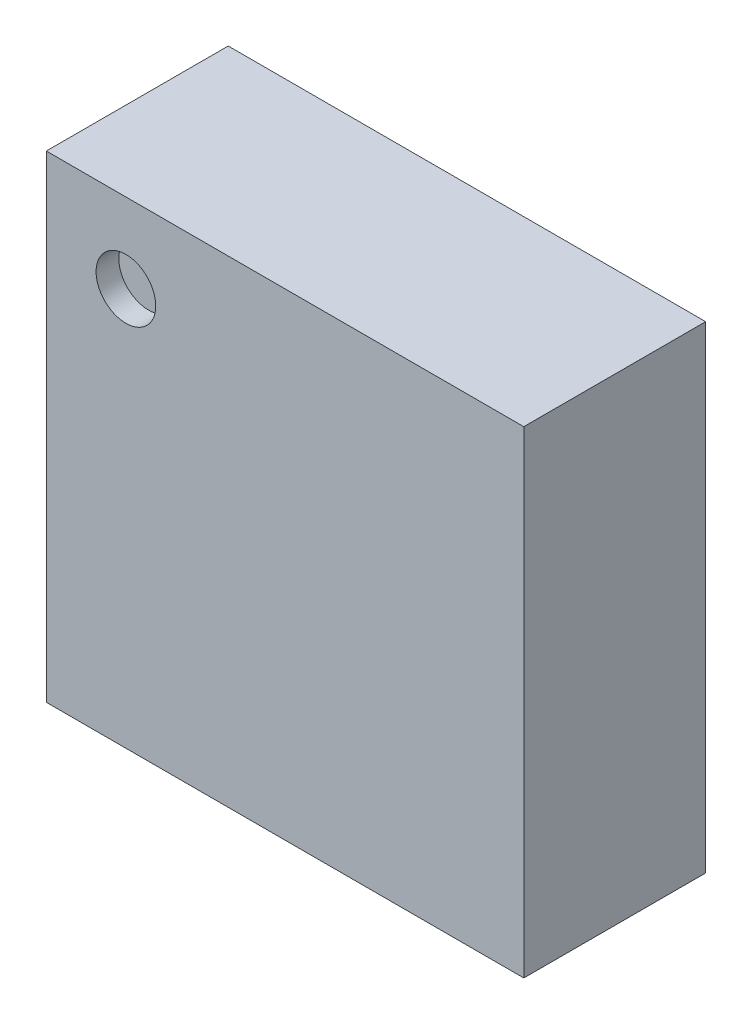
ISO-10303-21;
HEADER;
FILE_DESCRIPTION(('STEP AP214'),'2;1');
FILE_NAME('part.step','',(''),(''),'','','');
FILE_SCHEMA(('AUTOMOTIVE_DESIGN { 1 0 10303 214 1 1 1 1 }'));
ENDSEC;
DATA;
#1=APPLICATION_CONTEXT('core data for automotive mechanical design processes');
#2=APPLICATION_PROTOCOL_DEFINITION('international standard','automotive_design',2000,#1);
#3=PRODUCT_CONTEXT('',#1,'mechanical');
#4=PRODUCT('Part','Part','',(#3));
#5=PRODUCT_RELATED_PRODUCT_CATEGORY('part','',(#4));
#6=PRODUCT_DEFINITION_FORMATION('','',#4);
#7=PRODUCT_DEFINITION_CONTEXT('part definition',#1,'design');
#8=PRODUCT_DEFINITION('design','',#6,#7);
#9=PRODUCT_DEFINITION_SHAPE('','',#8);
#10=(LENGTH_UNIT() NAMED_UNIT(*) SI_UNIT(.MILLI.,.METRE.));
#11=(NAMED_UNIT(*) PLANE_ANGLE_UNIT() SI_UNIT($,.RADIAN.));
#12=(NAMED_UNIT(*) SI_UNIT($,.STERADIAN.) SOLID_ANGLE_UNIT());
#13=UNCERTAINTY_MEASURE_WITH_UNIT(LENGTH_MEASURE(1.E-05),#10,'distance_accuracy_value','');
#14=(GEOMETRIC_REPRESENTATION_CONTEXT(3) GLOBAL_UNCERTAINTY_ASSIGNED_CONTEXT((#13)) GLOBAL_UNIT_ASSIGNED_CONTEXT((#10,
#11,#12)) REPRESENTATION_CONTEXT('',''));
#15=CARTESIAN_POINT('',(0.,0.,0.));
#16=DIRECTION('',(0.,0.,1.));
#17=DIRECTION('',(1.,0.,0.));
#18=AXIS2_PLACEMENT_3D('',#15,#16,#17);
#19=CARTESIAN_POINT('',(0.35,1.75,0.7));
#20=DIRECTION('',(0.,0.,1.));
#21=DIRECTION('',(1.,0.,0.));
#22=AXIS2_PLACEMENT_3D('',#19,#20,#21);
#23=PLANE('',#22);
#24=CARTESIAN_POINT('',(0.35,1.75,0.7));
#25=DIRECTION('',(0.,0.,1.));
#26=DIRECTION('',(1.,0.,0.));
#27=AXIS2_PLACEMENT_3D('',#24,#25,#26);
#28=CIRCLE('',#27,0.13125);
#29=CARTESIAN_POINT('',(0.48125,1.75,0.7));
#30=VERTEX_POINT('',#29);
#31=EDGE_CURVE('E20',#30,#30,#28,.T.);
#32=ORIENTED_EDGE('',*,*,#31,.T.);
#33=EDGE_LOOP('',(#32));
#34=FACE_BOUND('',#33,.T.);
#35=ADVANCED_FACE('F17',(#34),#23,.T.);
#36=CARTESIAN_POINT('',(0.35,1.75,0.7));
#37=DIRECTION('',(0.,0.,1.));
#38=DIRECTION('',(1.,0.,0.));
#39=AXIS2_PLACEMENT_3D('',#36,#37,#38);
#40=CYLINDRICAL_SURFACE('',#39,0.13125);
#41=CARTESIAN_POINT('',(0.35,1.75,0.8));
#42=DIRECTION('',(0.,0.,1.));
#43=DIRECTION('',(1.,0.,0.));
#44=AXIS2_PLACEMENT_3D('',#41,#42,#43);
#45=CIRCLE('',#44,0.13125);
#46=CARTESIAN_POINT('',(0.48125,1.75,0.8));
#47=VERTEX_POINT('',#46);
#48=EDGE_CURVE('E66',#47,#47,#45,.F.);
#49=ORIENTED_EDGE('',*,*,#48,.F.);
#50=EDGE_LOOP('',(#49));
#51=FACE_BOUND('',#50,.T.);
#52=ORIENTED_EDGE('',*,*,#31,.F.);
#53=EDGE_LOOP('',(#52));
#54=FACE_BOUND('',#53,.T.);
#55=ADVANCED_FACE('F87',(#51,#54),#40,.F.);
#56=CARTESIAN_POINT('',(0.,0.,0.8));
#57=DIRECTION('',(0.,0.,1.));
#58=DIRECTION('',(1.,0.,0.));
#59=AXIS2_PLACEMENT_3D('',#56,#57,#58);
#60=PLANE('',#59);
#61=ORIENTED_EDGE('',*,*,#48,.T.);
#62=EDGE_LOOP('',(#61));
#63=FACE_BOUND('',#62,.T.);
#64=DIRECTION('',(0.,1.,0.));
#65=VECTOR('',#64,1.);
#66=CARTESIAN_POINT('',(2.1,0.,0.8));
#67=LINE('',#66,#65);
#68=CARTESIAN_POINT('',(2.1,2.1,0.8));
#69=VERTEX_POINT('',#68);
#70=CARTESIAN_POINT('',(2.1,0.,0.8));
#71=VERTEX_POINT('',#70);
#72=EDGE_CURVE('E166',#69,#71,#67,.F.);
#73=ORIENTED_EDGE('',*,*,#72,.F.);
#74=DIRECTION('',(1.,0.,0.));
#75=VECTOR('',#74,1.);
#76=CARTESIAN_POINT('',(0.,2.1,0.8));
#77=LINE('',#76,#75);
#78=CARTESIAN_POINT('',(0.,2.1,0.8));
#79=VERTEX_POINT('',#78);
#80=EDGE_CURVE('E60',#79,#69,#77,.T.);
#81=ORIENTED_EDGE('',*,*,#80,.F.);
#82=DIRECTION('',(0.,1.,0.));
#83=VECTOR('',#82,1.);
#84=CARTESIAN_POINT('',(0.,0.,0.8));
#85=LINE('',#84,#83);
#86=CARTESIAN_POINT('',(0.,0.,0.8));
#87=VERTEX_POINT('',#86);
#88=EDGE_CURVE('E58',#79,#87,#85,.F.);
#89=ORIENTED_EDGE('',*,*,#88,.T.);
#90=DIRECTION('',(1.,0.,0.));
#91=VECTOR('',#90,1.);
#92=CARTESIAN_POINT('',(0.,0.,0.8));
#93=LINE('',#92,#91);
#94=EDGE_CURVE('E55',#87,#71,#93,.T.);
#95=ORIENTED_EDGE('',*,*,#94,.T.);
#96=EDGE_LOOP('',(#73,#81,#89,#95));
#97=FACE_BOUND('',#96,.T.);
#98=ADVANCED_FACE('F59',(#63,#97),#60,.T.);
#99=CARTESIAN_POINT('',(0.,0.,0.));
#100=DIRECTION('',(1.,0.,0.));
#101=DIRECTION('',(0.,0.,-1.));
#102=AXIS2_PLACEMENT_3D('',#99,#100,#101);
#103=PLANE('',#102);
#104=DIRECTION('',(0.,0.,1.));
#105=VECTOR('',#104,1.);
#106=CARTESIAN_POINT('',(0.,2.1,0.));
#107=LINE('',#106,#105);
#108=CARTESIAN_POINT('',(0.,2.1,0.));
#109=VERTEX_POINT('',#108);
#110=EDGE_CURVE('E170',#109,#79,#107,.T.);
#111=ORIENTED_EDGE('',*,*,#110,.F.);
#112=DIRECTION('',(0.,1.,0.));
#113=VECTOR('',#112,1.);
#114=CARTESIAN_POINT('',(0.,0.,0.));
#115=LINE('',#114,#113);
#116=CARTESIAN_POINT('',(0.,0.,0.));
#117=VERTEX_POINT('',#116);
#118=EDGE_CURVE('E77',#109,#117,#115,.F.);
#119=ORIENTED_EDGE('',*,*,#118,.T.);
#120=DIRECTION('',(0.,0.,1.));
#121=VECTOR('',#120,1.);
#122=CARTESIAN_POINT('',(0.,0.,0.));
#123=LINE('',#122,#121);
#124=EDGE_CURVE('E65',#117,#87,#123,.T.);
#125=ORIENTED_EDGE('',*,*,#124,.T.);
#126=ORIENTED_EDGE('',*,*,#88,.F.);
#127=EDGE_LOOP('',(#111,#119,#125,#126));
#128=FACE_BOUND('',#127,.T.);
#129=ADVANCED_FACE('F76',(#128),#103,.F.);
#130=CARTESIAN_POINT('',(0.,0.,0.));
#131=DIRECTION('',(0.,1.,0.));
#132=DIRECTION('',(0.,0.,1.));
#133=AXIS2_PLACEMENT_3D('',#130,#131,#132);
#134=PLANE('',#133);
#135=ORIENTED_EDGE('',*,*,#94,.F.);
#136=ORIENTED_EDGE('',*,*,#124,.F.);
#137=DIRECTION('',(1.,0.,0.));
#138=VECTOR('',#137,1.);
#139=CARTESIAN_POINT('',(0.,0.,0.));
#140=LINE('',#139,#138);
#141=CARTESIAN_POINT('',(2.1,0.,0.));
#142=VERTEX_POINT('',#141);
#143=EDGE_CURVE('E168',#117,#142,#140,.T.);
#144=ORIENTED_EDGE('',*,*,#143,.T.);
#145=DIRECTION('',(0.,0.,-1.));
#146=VECTOR('',#145,1.);
#147=CARTESIAN_POINT('',(2.1,0.,0.));
#148=LINE('',#147,#146);
#149=EDGE_CURVE('E73',#71,#142,#148,.T.);
#150=ORIENTED_EDGE('',*,*,#149,.F.);
#151=EDGE_LOOP('',(#135,#136,#144,#150));
#152=FACE_BOUND('',#151,.T.);
#153=ADVANCED_FACE('F70',(#152),#134,.F.);
#154=CARTESIAN_POINT('',(2.1,0.,0.));
#155=DIRECTION('',(1.,0.,0.));
#156=DIRECTION('',(0.,0.,-1.));
#157=AXIS2_PLACEMENT_3D('',#154,#155,#156);
#158=PLANE('',#157);
#159=DIRECTION('',(0.,0.,1.));
#160=VECTOR('',#159,1.);
#161=CARTESIAN_POINT('',(2.1,2.1,0.));
#162=LINE('',#161,#160);
#163=CARTESIAN_POINT('',(2.1,2.1,0.));
#164=VERTEX_POINT('',#163);
#165=EDGE_CURVE('E34',#69,#164,#162,.F.);
#166=ORIENTED_EDGE('',*,*,#165,.F.);
#167=ORIENTED_EDGE('',*,*,#72,.T.);
#168=ORIENTED_EDGE('',*,*,#149,.T.);
#169=DIRECTION('',(0.,1.,0.));
#170=VECTOR('',#169,1.);
#171=CARTESIAN_POINT('',(2.1,0.,0.));
#172=LINE('',#171,#170);
#173=EDGE_CURVE('E26',#142,#164,#172,.T.);
#174=ORIENTED_EDGE('',*,*,#173,.T.);
#175=EDGE_LOOP('',(#166,#167,#168,#174));
#176=FACE_BOUND('',#175,.T.);
#177=ADVANCED_FACE('F104',(#176),#158,.T.);
#178=CARTESIAN_POINT('',(0.,2.1,0.));
#179=DIRECTION('',(0.,1.,0.));
#180=DIRECTION('',(0.,0.,1.));
#181=AXIS2_PLACEMENT_3D('',#178,#179,#180);
#182=PLANE('',#181);
#183=ORIENTED_EDGE('',*,*,#80,.T.);
#184=ORIENTED_EDGE('',*,*,#165,.T.);
#185=DIRECTION('',(1.,0.,0.));
#186=VECTOR('',#185,1.);
#187=CARTESIAN_POINT('',(0.,2.1,0.));
#188=LINE('',#187,#186);
#189=EDGE_CURVE('E11',#164,#109,#188,.F.);
#190=ORIENTED_EDGE('',*,*,#189,.T.);
#191=ORIENTED_EDGE('',*,*,#110,.T.);
#192=EDGE_LOOP('',(#183,#184,#190,#191));
#193=FACE_BOUND('',#192,.T.);
#194=ADVANCED_FACE('F98',(#193),#182,.T.);
#195=CARTESIAN_POINT('',(0.,0.,0.));
#196=DIRECTION('',(0.,0.,1.));
#197=DIRECTION('',(1.,0.,0.));
#198=AXIS2_PLACEMENT_3D('',#195,#196,#197);
#199=PLANE('',#198);
#200=ORIENTED_EDGE('',*,*,#173,.F.);
#201=ORIENTED_EDGE('',*,*,#143,.F.);
#202=ORIENTED_EDGE('',*,*,#118,.F.);
#203=ORIENTED_EDGE('',*,*,#189,.F.);
#204=EDGE_LOOP('',(#200,#201,#202,#203));
#205=FACE_BOUND('',#204,.T.);
#206=ADVANCED_FACE('F96',(#205),#199,.F.);
#207=CLOSED_SHELL('',(#35,#55,#98,#129,#153,#177,#194,#206));
#208=MANIFOLD_SOLID_BREP('B1',#207);
#209=ADVANCED_BREP_SHAPE_REPRESENTATION('',(#18,#208),#14);
#210=SHAPE_DEFINITION_REPRESENTATION(#9,#209);
ENDSEC;
END-ISO-10303-21;
